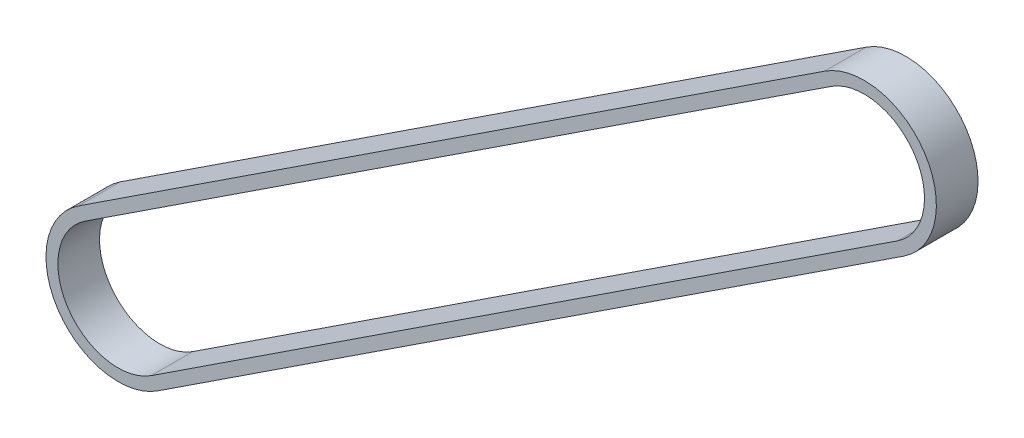
ISO-10303-21;
HEADER;
FILE_DESCRIPTION(('STEP AP214'),'2;1');
FILE_NAME('part.step','',(''),(''),'','','');
FILE_SCHEMA(('AUTOMOTIVE_DESIGN { 1 0 10303 214 1 1 1 1 }'));
ENDSEC;
DATA;
#1=APPLICATION_CONTEXT('core data for automotive mechanical design processes');
#2=APPLICATION_PROTOCOL_DEFINITION('international standard','automotive_design',2000,#1);
#3=PRODUCT_CONTEXT('',#1,'mechanical');
#4=PRODUCT('Part','Part','',(#3));
#5=PRODUCT_RELATED_PRODUCT_CATEGORY('part','',(#4));
#6=PRODUCT_DEFINITION_FORMATION('','',#4);
#7=PRODUCT_DEFINITION_CONTEXT('part definition',#1,'design');
#8=PRODUCT_DEFINITION('design','',#6,#7);
#9=PRODUCT_DEFINITION_SHAPE('','',#8);
#10=(LENGTH_UNIT() NAMED_UNIT(*) SI_UNIT(.MILLI.,.METRE.));
#11=(NAMED_UNIT(*) PLANE_ANGLE_UNIT() SI_UNIT($,.RADIAN.));
#12=(NAMED_UNIT(*) SI_UNIT($,.STERADIAN.) SOLID_ANGLE_UNIT());
#13=UNCERTAINTY_MEASURE_WITH_UNIT(LENGTH_MEASURE(1.E-05),#10,'distance_accuracy_value','');
#14=(GEOMETRIC_REPRESENTATION_CONTEXT(3) GLOBAL_UNCERTAINTY_ASSIGNED_CONTEXT((#13)) GLOBAL_UNIT_ASSIGNED_CONTEXT((#10,
#11,#12)) REPRESENTATION_CONTEXT('',''));
#15=CARTESIAN_POINT('',(0.,0.,0.));
#16=DIRECTION('',(0.,0.,1.));
#17=DIRECTION('',(1.,0.,0.));
#18=AXIS2_PLACEMENT_3D('',#15,#16,#17);
#19=CARTESIAN_POINT('',(48.1886283448036,-33.2455709434663,3.5));
#20=DIRECTION('',(0.,0.,-1.));
#21=DIRECTION('',(-1.,0.,0.));
#22=AXIS2_PLACEMENT_3D('',#19,#20,#21);
#23=PLANE('',#22);
#24=CARTESIAN_POINT('',(48.1886283448036,-33.2455709434663,3.5));
#25=DIRECTION('',(0.,0.,-1.));
#26=DIRECTION('',(-1.,0.,0.));
#27=AXIS2_PLACEMENT_3D('',#24,#25,#26);
#28=CIRCLE('',#27,12.125);
#29=CARTESIAN_POINT('',(41.535202994324,-23.1091240262475,3.5));
#30=VERTEX_POINT('',#29);
#31=CARTESIAN_POINT('',(54.8420536952832,-43.3820178606852,3.5));
#32=VERTEX_POINT('',#31);
#33=EDGE_CURVE('E160',#30,#32,#28,.F.);
#34=ORIENTED_EDGE('',*,*,#33,.T.);
#35=DIRECTION('',(0.835995622038669,0.548736111379758,0.));
#36=VECTOR('',#35,1.);
#37=CARTESIAN_POINT('',(54.8420536952832,-43.3820178606852,3.5));
#38=LINE('',#37,#36);
#39=CARTESIAN_POINT('',(180.241397001087,38.9283988462808,3.5));
#40=VERTEX_POINT('',#39);
#41=EDGE_CURVE('E163',#32,#40,#38,.T.);
#42=ORIENTED_EDGE('',*,*,#41,.T.);
#43=CARTESIAN_POINT('',(173.587971650607,49.0648457634996,3.5));
#44=DIRECTION('',(0.,0.,-1.));
#45=DIRECTION('',(-1.,0.,0.));
#46=AXIS2_PLACEMENT_3D('',#43,#44,#45);
#47=CIRCLE('',#46,12.125);
#48=CARTESIAN_POINT('',(166.934546300128,59.2012926807185,3.5));
#49=VERTEX_POINT('',#48);
#50=EDGE_CURVE('E166',#40,#49,#47,.F.);
#51=ORIENTED_EDGE('',*,*,#50,.T.);
#52=DIRECTION('',(-0.835995622038669,-0.548736111379758,0.));
#53=VECTOR('',#52,1.);
#54=CARTESIAN_POINT('',(41.535202994324,-23.1091240262475,3.5));
#55=LINE('',#54,#53);
#56=EDGE_CURVE('E168',#49,#30,#55,.T.);
#57=ORIENTED_EDGE('',*,*,#56,.T.);
#58=EDGE_LOOP('',(#34,#42,#51,#57));
#59=FACE_BOUND('',#58,.T.);
#60=CARTESIAN_POINT('',(48.1886283448036,-33.2455709434663,3.5));
#61=DIRECTION('',(0.,0.,1.));
#62=DIRECTION('',(-1.,0.,0.));
#63=AXIS2_PLACEMENT_3D('',#60,#61,#62);
#64=CIRCLE('',#63,10.125);
#65=CARTESIAN_POINT('',(42.6326752170836,-24.7811152703248,3.5));
#66=VERTEX_POINT('',#65);
#67=CARTESIAN_POINT('',(53.7445814725237,-41.7100266166079,3.5));
#68=VERTEX_POINT('',#67);
#69=EDGE_CURVE('E124',#66,#68,#64,.T.);
#70=ORIENTED_EDGE('',*,*,#69,.F.);
#71=DIRECTION('',(-0.835995622038669,-0.548736111379758,0.));
#72=VECTOR('',#71,1.);
#73=CARTESIAN_POINT('',(42.6326752170836,-24.7811152703248,3.5));
#74=LINE('',#73,#72);
#75=CARTESIAN_POINT('',(168.032018522887,57.5293014366412,3.5));
#76=VERTEX_POINT('',#75);
#77=EDGE_CURVE('E146',#76,#66,#74,.T.);
#78=ORIENTED_EDGE('',*,*,#77,.F.);
#79=CARTESIAN_POINT('',(173.587971650607,49.0648457634996,3.5));
#80=DIRECTION('',(0.,0.,1.));
#81=DIRECTION('',(-1.,0.,0.));
#82=AXIS2_PLACEMENT_3D('',#79,#80,#81);
#83=CIRCLE('',#82,10.125);
#84=CARTESIAN_POINT('',(179.143924778327,40.6003900903581,3.5));
#85=VERTEX_POINT('',#84);
#86=EDGE_CURVE('E144',#85,#76,#83,.T.);
#87=ORIENTED_EDGE('',*,*,#86,.F.);
#88=DIRECTION('',(0.835995622038669,0.548736111379758,0.));
#89=VECTOR('',#88,1.);
#90=CARTESIAN_POINT('',(179.143924778327,40.6003900903581,3.5));
#91=LINE('',#90,#89);
#92=EDGE_CURVE('E132',#68,#85,#91,.T.);
#93=ORIENTED_EDGE('',*,*,#92,.F.);
#94=EDGE_LOOP('',(#70,#78,#87,#93));
#95=FACE_BOUND('',#94,.T.);
#96=ADVANCED_FACE('F59',(#59,#95),#23,.F.);
#97=CARTESIAN_POINT('',(48.1886283448036,-33.2455709434663,-3.5));
#98=DIRECTION('',(0.,0.,-1.));
#99=DIRECTION('',(-1.,0.,0.));
#100=AXIS2_PLACEMENT_3D('',#97,#98,#99);
#101=PLANE('',#100);
#102=CARTESIAN_POINT('',(48.1886283448036,-33.2455709434663,-3.5));
#103=DIRECTION('',(0.,0.,-1.));
#104=DIRECTION('',(-1.,0.,0.));
#105=AXIS2_PLACEMENT_3D('',#102,#103,#104);
#106=CIRCLE('',#105,12.125);
#107=CARTESIAN_POINT('',(41.535202994324,-23.1091240262475,-3.5));
#108=VERTEX_POINT('',#107);
#109=CARTESIAN_POINT('',(54.8420536952832,-43.3820178606852,-3.5));
#110=VERTEX_POINT('',#109);
#111=EDGE_CURVE('E140',#108,#110,#106,.F.);
#112=ORIENTED_EDGE('',*,*,#111,.F.);
#113=DIRECTION('',(-0.835995622038669,-0.548736111379758,0.));
#114=VECTOR('',#113,1.);
#115=CARTESIAN_POINT('',(41.535202994324,-23.1091240262475,-3.5));
#116=LINE('',#115,#114);
#117=CARTESIAN_POINT('',(166.934546300128,59.2012926807185,-3.5));
#118=VERTEX_POINT('',#117);
#119=EDGE_CURVE('E164',#118,#108,#116,.T.);
#120=ORIENTED_EDGE('',*,*,#119,.F.);
#121=CARTESIAN_POINT('',(173.587971650607,49.0648457634996,-3.5));
#122=DIRECTION('',(0.,0.,-1.));
#123=DIRECTION('',(-1.,0.,0.));
#124=AXIS2_PLACEMENT_3D('',#121,#122,#123);
#125=CIRCLE('',#124,12.125);
#126=CARTESIAN_POINT('',(180.241397001087,38.9283988462808,-3.5));
#127=VERTEX_POINT('',#126);
#128=EDGE_CURVE('E175',#127,#118,#125,.F.);
#129=ORIENTED_EDGE('',*,*,#128,.F.);
#130=DIRECTION('',(0.835995622038669,0.548736111379758,0.));
#131=VECTOR('',#130,1.);
#132=CARTESIAN_POINT('',(54.8420536952832,-43.3820178606852,-3.5));
#133=LINE('',#132,#131);
#134=EDGE_CURVE('E173',#110,#127,#133,.T.);
#135=ORIENTED_EDGE('',*,*,#134,.F.);
#136=EDGE_LOOP('',(#112,#120,#129,#135));
#137=FACE_BOUND('',#136,.T.);
#138=DIRECTION('',(-0.835995622038669,-0.548736111379758,0.));
#139=VECTOR('',#138,1.);
#140=CARTESIAN_POINT('',(42.6326752170836,-24.7811152703248,-3.5));
#141=LINE('',#140,#139);
#142=CARTESIAN_POINT('',(168.032018522887,57.5293014366412,-3.5));
#143=VERTEX_POINT('',#142);
#144=CARTESIAN_POINT('',(42.6326752170836,-24.7811152703248,-3.5));
#145=VERTEX_POINT('',#144);
#146=EDGE_CURVE('E133',#143,#145,#141,.T.);
#147=ORIENTED_EDGE('',*,*,#146,.T.);
#148=CARTESIAN_POINT('',(48.1886283448036,-33.2455709434663,-3.5));
#149=DIRECTION('',(0.,0.,1.));
#150=DIRECTION('',(-1.,0.,0.));
#151=AXIS2_PLACEMENT_3D('',#148,#149,#150);
#152=CIRCLE('',#151,10.125);
#153=CARTESIAN_POINT('',(53.7445814725237,-41.7100266166079,-3.5));
#154=VERTEX_POINT('',#153);
#155=EDGE_CURVE('E82',#145,#154,#152,.T.);
#156=ORIENTED_EDGE('',*,*,#155,.T.);
#157=DIRECTION('',(0.835995622038669,0.548736111379758,0.));
#158=VECTOR('',#157,1.);
#159=CARTESIAN_POINT('',(179.143924778327,40.6003900903581,-3.5));
#160=LINE('',#159,#158);
#161=CARTESIAN_POINT('',(179.143924778327,40.6003900903581,-3.5));
#162=VERTEX_POINT('',#161);
#163=EDGE_CURVE('E139',#154,#162,#160,.T.);
#164=ORIENTED_EDGE('',*,*,#163,.T.);
#165=CARTESIAN_POINT('',(173.587971650607,49.0648457634996,-3.5));
#166=DIRECTION('',(0.,0.,1.));
#167=DIRECTION('',(-1.,0.,0.));
#168=AXIS2_PLACEMENT_3D('',#165,#166,#167);
#169=CIRCLE('',#168,10.125);
#170=EDGE_CURVE('E152',#162,#143,#169,.T.);
#171=ORIENTED_EDGE('',*,*,#170,.T.);
#172=EDGE_LOOP('',(#147,#156,#164,#171));
#173=FACE_BOUND('',#172,.T.);
#174=ADVANCED_FACE('F193',(#137,#173),#101,.T.);
#175=CARTESIAN_POINT('',(48.1886283448036,-33.2455709434663,3.5));
#176=DIRECTION('',(0.,0.,-1.));
#177=DIRECTION('',(-1.,0.,0.));
#178=AXIS2_PLACEMENT_3D('',#175,#176,#177);
#179=CYLINDRICAL_SURFACE('',#178,12.125);
#180=ORIENTED_EDGE('',*,*,#111,.T.);
#181=DIRECTION('',(0.,0.,-1.));
#182=VECTOR('',#181,1.);
#183=CARTESIAN_POINT('',(54.8420536952832,-43.3820178606852,3.5));
#184=LINE('',#183,#182);
#185=EDGE_CURVE('E12',#32,#110,#184,.T.);
#186=ORIENTED_EDGE('',*,*,#185,.F.);
#187=ORIENTED_EDGE('',*,*,#33,.F.);
#188=DIRECTION('',(0.,0.,-1.));
#189=VECTOR('',#188,1.);
#190=CARTESIAN_POINT('',(41.535202994324,-23.1091240262475,3.5));
#191=LINE('',#190,#189);
#192=EDGE_CURVE('E170',#30,#108,#191,.T.);
#193=ORIENTED_EDGE('',*,*,#192,.T.);
#194=EDGE_LOOP('',(#180,#186,#187,#193));
#195=FACE_BOUND('',#194,.T.);
#196=ADVANCED_FACE('F61',(#195),#179,.T.);
#197=CARTESIAN_POINT('',(54.8420536952832,-43.3820178606852,3.5));
#198=DIRECTION('',(-0.548736111379758,0.835995622038669,0.));
#199=DIRECTION('',(-0.835995622038669,-0.548736111379758,0.));
#200=AXIS2_PLACEMENT_3D('',#197,#198,#199);
#201=PLANE('',#200);
#202=ORIENTED_EDGE('',*,*,#134,.T.);
#203=DIRECTION('',(0.,0.,-1.));
#204=VECTOR('',#203,1.);
#205=CARTESIAN_POINT('',(180.241397001087,38.9283988462808,3.5));
#206=LINE('',#205,#204);
#207=EDGE_CURVE('E67',#40,#127,#206,.T.);
#208=ORIENTED_EDGE('',*,*,#207,.F.);
#209=ORIENTED_EDGE('',*,*,#41,.F.);
#210=ORIENTED_EDGE('',*,*,#185,.T.);
#211=EDGE_LOOP('',(#202,#208,#209,#210));
#212=FACE_BOUND('',#211,.T.);
#213=ADVANCED_FACE('F203',(#212),#201,.F.);
#214=CARTESIAN_POINT('',(173.587971650607,49.0648457634996,3.5));
#215=DIRECTION('',(0.,0.,-1.));
#216=DIRECTION('',(-1.,0.,0.));
#217=AXIS2_PLACEMENT_3D('',#214,#215,#216);
#218=CYLINDRICAL_SURFACE('',#217,12.125);
#219=ORIENTED_EDGE('',*,*,#128,.T.);
#220=DIRECTION('',(0.,0.,-1.));
#221=VECTOR('',#220,1.);
#222=CARTESIAN_POINT('',(166.934546300128,59.2012926807185,3.5));
#223=LINE('',#222,#221);
#224=EDGE_CURVE('E180',#49,#118,#223,.T.);
#225=ORIENTED_EDGE('',*,*,#224,.F.);
#226=ORIENTED_EDGE('',*,*,#50,.F.);
#227=ORIENTED_EDGE('',*,*,#207,.T.);
#228=EDGE_LOOP('',(#219,#225,#226,#227));
#229=FACE_BOUND('',#228,.T.);
#230=ADVANCED_FACE('F187',(#229),#218,.T.);
#231=CARTESIAN_POINT('',(41.535202994324,-23.1091240262475,3.5));
#232=DIRECTION('',(0.548736111379758,-0.835995622038669,0.));
#233=DIRECTION('',(0.835995622038669,0.548736111379758,0.));
#234=AXIS2_PLACEMENT_3D('',#231,#232,#233);
#235=PLANE('',#234);
#236=ORIENTED_EDGE('',*,*,#119,.T.);
#237=ORIENTED_EDGE('',*,*,#192,.F.);
#238=ORIENTED_EDGE('',*,*,#56,.F.);
#239=ORIENTED_EDGE('',*,*,#224,.T.);
#240=EDGE_LOOP('',(#236,#237,#238,#239));
#241=FACE_BOUND('',#240,.T.);
#242=ADVANCED_FACE('F197',(#241),#235,.F.);
#243=CARTESIAN_POINT('',(48.1886283448036,-33.2455709434663,3.5));
#244=DIRECTION('',(0.,0.,-1.));
#245=DIRECTION('',(-1.,0.,0.));
#246=AXIS2_PLACEMENT_3D('',#243,#244,#245);
#247=CYLINDRICAL_SURFACE('',#246,10.125);
#248=ORIENTED_EDGE('',*,*,#155,.F.);
#249=DIRECTION('',(0.,0.,-1.));
#250=VECTOR('',#249,1.);
#251=CARTESIAN_POINT('',(42.6326752170836,-24.7811152703248,3.5));
#252=LINE('',#251,#250);
#253=EDGE_CURVE('E128',#66,#145,#252,.T.);
#254=ORIENTED_EDGE('',*,*,#253,.F.);
#255=ORIENTED_EDGE('',*,*,#69,.T.);
#256=DIRECTION('',(0.,0.,-1.));
#257=VECTOR('',#256,1.);
#258=CARTESIAN_POINT('',(53.7445814725237,-41.7100266166079,3.5));
#259=LINE('',#258,#257);
#260=EDGE_CURVE('E127',#68,#154,#259,.T.);
#261=ORIENTED_EDGE('',*,*,#260,.T.);
#262=EDGE_LOOP('',(#248,#254,#255,#261));
#263=FACE_BOUND('',#262,.T.);
#264=ADVANCED_FACE('F126',(#263),#247,.F.);
#265=CARTESIAN_POINT('',(179.143924778327,40.6003900903581,3.5));
#266=DIRECTION('',(-0.548736111379758,0.835995622038669,0.));
#267=DIRECTION('',(-0.835995622038669,-0.548736111379759,0.));
#268=AXIS2_PLACEMENT_3D('',#265,#266,#267);
#269=PLANE('',#268);
#270=ORIENTED_EDGE('',*,*,#163,.F.);
#271=ORIENTED_EDGE('',*,*,#260,.F.);
#272=ORIENTED_EDGE('',*,*,#92,.T.);
#273=DIRECTION('',(0.,0.,-1.));
#274=VECTOR('',#273,1.);
#275=CARTESIAN_POINT('',(179.143924778327,40.6003900903581,3.5));
#276=LINE('',#275,#274);
#277=EDGE_CURVE('E141',#85,#162,#276,.T.);
#278=ORIENTED_EDGE('',*,*,#277,.T.);
#279=EDGE_LOOP('',(#270,#271,#272,#278));
#280=FACE_BOUND('',#279,.T.);
#281=ADVANCED_FACE('F136',(#280),#269,.T.);
#282=CARTESIAN_POINT('',(173.587971650607,49.0648457634996,3.5));
#283=DIRECTION('',(0.,0.,-1.));
#284=DIRECTION('',(-1.,0.,0.));
#285=AXIS2_PLACEMENT_3D('',#282,#283,#284);
#286=CYLINDRICAL_SURFACE('',#285,10.125);
#287=ORIENTED_EDGE('',*,*,#170,.F.);
#288=ORIENTED_EDGE('',*,*,#277,.F.);
#289=ORIENTED_EDGE('',*,*,#86,.T.);
#290=DIRECTION('',(0.,0.,-1.));
#291=VECTOR('',#290,1.);
#292=CARTESIAN_POINT('',(168.032018522887,57.5293014366412,3.5));
#293=LINE('',#292,#291);
#294=EDGE_CURVE('E74',#76,#143,#293,.T.);
#295=ORIENTED_EDGE('',*,*,#294,.T.);
#296=EDGE_LOOP('',(#287,#288,#289,#295));
#297=FACE_BOUND('',#296,.T.);
#298=ADVANCED_FACE('F226',(#297),#286,.F.);
#299=CARTESIAN_POINT('',(42.6326752170836,-24.7811152703248,3.5));
#300=DIRECTION('',(0.548736111379758,-0.835995622038669,0.));
#301=DIRECTION('',(0.835995622038669,0.548736111379759,0.));
#302=AXIS2_PLACEMENT_3D('',#299,#300,#301);
#303=PLANE('',#302);
#304=ORIENTED_EDGE('',*,*,#146,.F.);
#305=ORIENTED_EDGE('',*,*,#294,.F.);
#306=ORIENTED_EDGE('',*,*,#77,.T.);
#307=ORIENTED_EDGE('',*,*,#253,.T.);
#308=EDGE_LOOP('',(#304,#305,#306,#307));
#309=FACE_BOUND('',#308,.T.);
#310=ADVANCED_FACE('F230',(#309),#303,.T.);
#311=CLOSED_SHELL('',(#96,#174,#196,#213,#230,#242,#264,#281,#298,#310));
#312=MANIFOLD_SOLID_BREP('B2',#311);
#313=ADVANCED_BREP_SHAPE_REPRESENTATION('',(#18,#312),#14);
#314=SHAPE_DEFINITION_REPRESENTATION(#9,#313);
ENDSEC;
END-ISO-10303-21;
